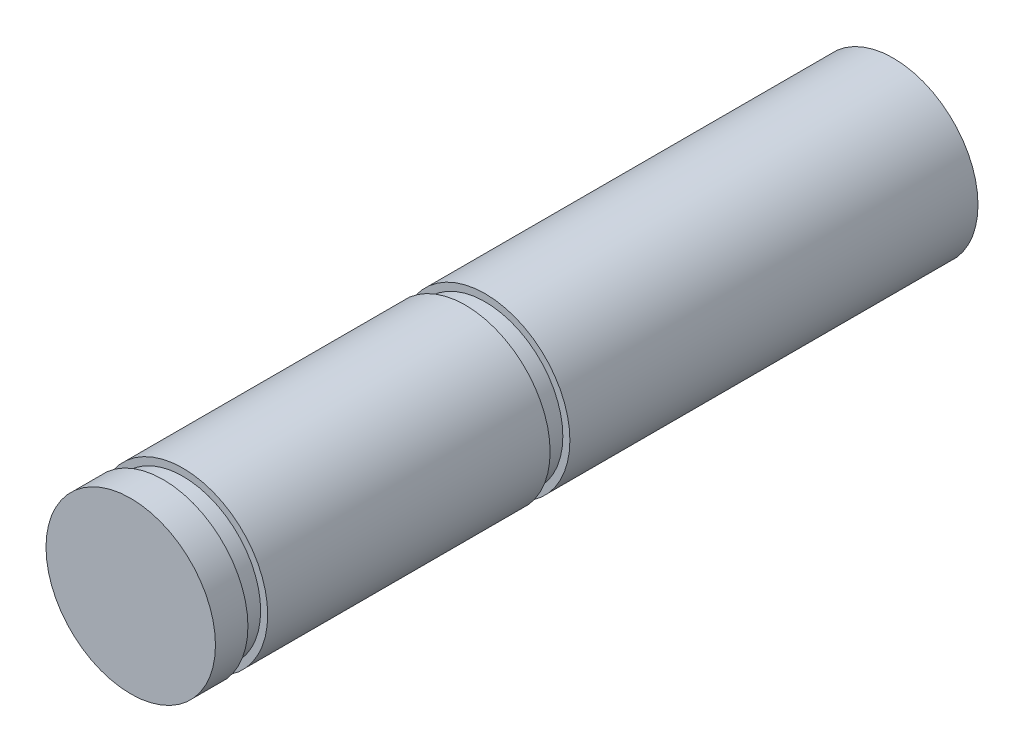
ISO-10303-21;
HEADER;
FILE_DESCRIPTION(('STEP AP214'),'2;1');
FILE_NAME('part.step','',(''),(''),'','','');
FILE_SCHEMA(('AUTOMOTIVE_DESIGN { 1 0 10303 214 1 1 1 1 }'));
ENDSEC;
DATA;
#1=APPLICATION_CONTEXT('core data for automotive mechanical design processes');
#2=APPLICATION_PROTOCOL_DEFINITION('international standard','automotive_design',2000,#1);
#3=PRODUCT_CONTEXT('',#1,'mechanical');
#4=PRODUCT('Part','Part','',(#3));
#5=PRODUCT_RELATED_PRODUCT_CATEGORY('part','',(#4));
#6=PRODUCT_DEFINITION_FORMATION('','',#4);
#7=PRODUCT_DEFINITION_CONTEXT('part definition',#1,'design');
#8=PRODUCT_DEFINITION('design','',#6,#7);
#9=PRODUCT_DEFINITION_SHAPE('','',#8);
#10=(LENGTH_UNIT() NAMED_UNIT(*) SI_UNIT(.MILLI.,.METRE.));
#11=(NAMED_UNIT(*) PLANE_ANGLE_UNIT() SI_UNIT($,.RADIAN.));
#12=(NAMED_UNIT(*) SI_UNIT($,.STERADIAN.) SOLID_ANGLE_UNIT());
#13=UNCERTAINTY_MEASURE_WITH_UNIT(LENGTH_MEASURE(1.E-05),#10,'distance_accuracy_value','');
#14=(GEOMETRIC_REPRESENTATION_CONTEXT(3) GLOBAL_UNCERTAINTY_ASSIGNED_CONTEXT((#13)) GLOBAL_UNIT_ASSIGNED_CONTEXT((#10,
#11,#12)) REPRESENTATION_CONTEXT('',''));
#15=CARTESIAN_POINT('',(0.,0.,0.));
#16=DIRECTION('',(0.,0.,1.));
#17=DIRECTION('',(1.,0.,0.));
#18=AXIS2_PLACEMENT_3D('',#15,#16,#17);
#19=CARTESIAN_POINT('',(0.,0.,27.));
#20=DIRECTION('',(0.,0.,-1.));
#21=DIRECTION('',(-1.,0.,0.));
#22=AXIS2_PLACEMENT_3D('',#19,#20,#21);
#23=CYLINDRICAL_SURFACE('',#22,3.);
#24=CARTESIAN_POINT('',(0.,0.,25.85));
#25=DIRECTION('',(0.,0.,1.));
#26=DIRECTION('',(1.,0.,0.));
#27=AXIS2_PLACEMENT_3D('',#24,#25,#26);
#28=CIRCLE('',#27,3.);
#29=CARTESIAN_POINT('',(3.,0.,25.85));
#30=VERTEX_POINT('',#29);
#31=EDGE_CURVE('E46',#30,#30,#28,.T.);
#32=ORIENTED_EDGE('',*,*,#31,.T.);
#33=EDGE_LOOP('',(#32));
#34=FACE_BOUND('',#33,.T.);
#35=CARTESIAN_POINT('',(0.,0.,27.));
#36=DIRECTION('',(0.,0.,1.));
#37=DIRECTION('',(1.,0.,0.));
#38=AXIS2_PLACEMENT_3D('',#35,#36,#37);
#39=CIRCLE('',#38,3.);
#40=CARTESIAN_POINT('',(3.,0.,27.));
#41=VERTEX_POINT('',#40);
#42=EDGE_CURVE('E10',#41,#41,#39,.T.);
#43=ORIENTED_EDGE('',*,*,#42,.F.);
#44=EDGE_LOOP('',(#43));
#45=FACE_BOUND('',#44,.T.);
#46=ADVANCED_FACE('F36',(#34,#45),#23,.T.);
#47=CARTESIAN_POINT('',(0.,0.,27.));
#48=DIRECTION('',(0.,0.,1.));
#49=DIRECTION('',(1.,0.,0.));
#50=AXIS2_PLACEMENT_3D('',#47,#48,#49);
#51=PLANE('',#50);
#52=ORIENTED_EDGE('',*,*,#42,.T.);
#53=EDGE_LOOP('',(#52));
#54=FACE_BOUND('',#53,.T.);
#55=ADVANCED_FACE('F95',(#54),#51,.T.);
#56=CARTESIAN_POINT('',(0.,0.,25.85));
#57=DIRECTION('',(0.,0.,1.));
#58=DIRECTION('',(1.,0.,0.));
#59=AXIS2_PLACEMENT_3D('',#56,#57,#58);
#60=PLANE('',#59);
#61=ORIENTED_EDGE('',*,*,#31,.F.);
#62=EDGE_LOOP('',(#61));
#63=FACE_BOUND('',#62,.T.);
#64=CARTESIAN_POINT('',(0.,0.,25.85));
#65=DIRECTION('',(0.,0.,1.));
#66=DIRECTION('',(1.,0.,0.));
#67=AXIS2_PLACEMENT_3D('',#64,#65,#66);
#68=CIRCLE('',#67,2.75);
#69=CARTESIAN_POINT('',(2.75,0.,25.85));
#70=VERTEX_POINT('',#69);
#71=EDGE_CURVE('E50',#70,#70,#68,.T.);
#72=ORIENTED_EDGE('',*,*,#71,.T.);
#73=EDGE_LOOP('',(#72));
#74=FACE_BOUND('',#73,.T.);
#75=ADVANCED_FACE('F100',(#63,#74),#60,.F.);
#76=CARTESIAN_POINT('',(0.,0.,25.85));
#77=DIRECTION('',(0.,0.,-1.));
#78=DIRECTION('',(-1.,0.,0.));
#79=AXIS2_PLACEMENT_3D('',#76,#77,#78);
#80=CYLINDRICAL_SURFACE('',#79,2.75);
#81=ORIENTED_EDGE('',*,*,#71,.F.);
#82=EDGE_LOOP('',(#81));
#83=FACE_BOUND('',#82,.T.);
#84=CARTESIAN_POINT('',(0.,0.,25.15));
#85=DIRECTION('',(0.,0.,1.));
#86=DIRECTION('',(1.,0.,0.));
#87=AXIS2_PLACEMENT_3D('',#84,#85,#86);
#88=CIRCLE('',#87,2.75);
#89=CARTESIAN_POINT('',(2.75,0.,25.15));
#90=VERTEX_POINT('',#89);
#91=EDGE_CURVE('E56',#90,#90,#88,.T.);
#92=ORIENTED_EDGE('',*,*,#91,.T.);
#93=EDGE_LOOP('',(#92));
#94=FACE_BOUND('',#93,.T.);
#95=ADVANCED_FACE('F107',(#83,#94),#80,.T.);
#96=CARTESIAN_POINT('',(0.,0.,25.15));
#97=DIRECTION('',(0.,0.,1.));
#98=DIRECTION('',(1.,0.,0.));
#99=AXIS2_PLACEMENT_3D('',#96,#97,#98);
#100=PLANE('',#99);
#101=ORIENTED_EDGE('',*,*,#91,.F.);
#102=EDGE_LOOP('',(#101));
#103=FACE_BOUND('',#102,.T.);
#104=CARTESIAN_POINT('',(0.,0.,25.15));
#105=DIRECTION('',(0.,0.,1.));
#106=DIRECTION('',(1.,0.,0.));
#107=AXIS2_PLACEMENT_3D('',#104,#105,#106);
#108=CIRCLE('',#107,3.);
#109=CARTESIAN_POINT('',(3.,0.,25.15));
#110=VERTEX_POINT('',#109);
#111=EDGE_CURVE('E53',#110,#110,#108,.T.);
#112=ORIENTED_EDGE('',*,*,#111,.T.);
#113=EDGE_LOOP('',(#112));
#114=FACE_BOUND('',#113,.T.);
#115=ADVANCED_FACE('F92',(#103,#114),#100,.T.);
#116=CARTESIAN_POINT('',(0.,0.,15.15));
#117=DIRECTION('',(0.,0.,1.));
#118=DIRECTION('',(1.,0.,0.));
#119=AXIS2_PLACEMENT_3D('',#116,#117,#118);
#120=CIRCLE('',#119,3.);
#121=CARTESIAN_POINT('',(3.,0.,15.15));
#122=VERTEX_POINT('',#121);
#123=EDGE_CURVE('E60',#122,#122,#120,.T.);
#124=ORIENTED_EDGE('',*,*,#123,.T.);
#125=EDGE_LOOP('',(#124));
#126=FACE_BOUND('',#125,.T.);
#127=ORIENTED_EDGE('',*,*,#111,.F.);
#128=EDGE_LOOP('',(#127));
#129=FACE_BOUND('',#128,.T.);
#130=ADVANCED_FACE('F79',(#126,#129),#23,.T.);
#131=CARTESIAN_POINT('',(0.,0.,14.45));
#132=DIRECTION('',(0.,0.,1.));
#133=DIRECTION('',(1.,0.,0.));
#134=AXIS2_PLACEMENT_3D('',#131,#132,#133);
#135=PLANE('',#134);
#136=CARTESIAN_POINT('',(0.,0.,14.45));
#137=DIRECTION('',(0.,0.,1.));
#138=DIRECTION('',(1.,0.,0.));
#139=AXIS2_PLACEMENT_3D('',#136,#137,#138);
#140=CIRCLE('',#139,2.75);
#141=CARTESIAN_POINT('',(2.75,0.,14.45));
#142=VERTEX_POINT('',#141);
#143=EDGE_CURVE('E63',#142,#142,#140,.T.);
#144=ORIENTED_EDGE('',*,*,#143,.F.);
#145=EDGE_LOOP('',(#144));
#146=FACE_BOUND('',#145,.T.);
#147=CARTESIAN_POINT('',(0.,0.,14.45));
#148=DIRECTION('',(0.,0.,1.));
#149=DIRECTION('',(1.,0.,0.));
#150=AXIS2_PLACEMENT_3D('',#147,#148,#149);
#151=CIRCLE('',#150,3.);
#152=CARTESIAN_POINT('',(3.,0.,14.45));
#153=VERTEX_POINT('',#152);
#154=EDGE_CURVE('E59',#153,#153,#151,.T.);
#155=ORIENTED_EDGE('',*,*,#154,.T.);
#156=EDGE_LOOP('',(#155));
#157=FACE_BOUND('',#156,.T.);
#158=ADVANCED_FACE('F75',(#146,#157),#135,.T.);
#159=CARTESIAN_POINT('',(0.,0.,15.15));
#160=DIRECTION('',(0.,0.,1.));
#161=DIRECTION('',(1.,0.,0.));
#162=AXIS2_PLACEMENT_3D('',#159,#160,#161);
#163=PLANE('',#162);
#164=CARTESIAN_POINT('',(0.,0.,15.15));
#165=DIRECTION('',(0.,0.,1.));
#166=DIRECTION('',(1.,0.,0.));
#167=AXIS2_PLACEMENT_3D('',#164,#165,#166);
#168=CIRCLE('',#167,2.75);
#169=CARTESIAN_POINT('',(2.75,0.,15.15));
#170=VERTEX_POINT('',#169);
#171=EDGE_CURVE('E66',#170,#170,#168,.T.);
#172=ORIENTED_EDGE('',*,*,#171,.T.);
#173=EDGE_LOOP('',(#172));
#174=FACE_BOUND('',#173,.T.);
#175=ORIENTED_EDGE('',*,*,#123,.F.);
#176=EDGE_LOOP('',(#175));
#177=FACE_BOUND('',#176,.T.);
#178=ADVANCED_FACE('F78',(#174,#177),#163,.F.);
#179=CARTESIAN_POINT('',(0.,0.,14.45));
#180=DIRECTION('',(0.,0.,1.));
#181=DIRECTION('',(1.,0.,0.));
#182=AXIS2_PLACEMENT_3D('',#179,#180,#181);
#183=CYLINDRICAL_SURFACE('',#182,2.75);
#184=ORIENTED_EDGE('',*,*,#143,.T.);
#185=EDGE_LOOP('',(#184));
#186=FACE_BOUND('',#185,.T.);
#187=ORIENTED_EDGE('',*,*,#171,.F.);
#188=EDGE_LOOP('',(#187));
#189=FACE_BOUND('',#188,.T.);
#190=ADVANCED_FACE('F72',(#186,#189),#183,.T.);
#191=CARTESIAN_POINT('',(0.,0.,0.));
#192=DIRECTION('',(0.,0.,1.));
#193=DIRECTION('',(1.,0.,0.));
#194=AXIS2_PLACEMENT_3D('',#191,#192,#193);
#195=PLANE('',#194);
#196=CARTESIAN_POINT('',(0.,0.,0.));
#197=DIRECTION('',(0.,0.,1.));
#198=DIRECTION('',(1.,0.,0.));
#199=AXIS2_PLACEMENT_3D('',#196,#197,#198);
#200=CIRCLE('',#199,3.);
#201=CARTESIAN_POINT('',(3.,0.,0.));
#202=VERTEX_POINT('',#201);
#203=EDGE_CURVE('E39',#202,#202,#200,.T.);
#204=ORIENTED_EDGE('',*,*,#203,.F.);
#205=EDGE_LOOP('',(#204));
#206=FACE_BOUND('',#205,.T.);
#207=ADVANCED_FACE('F85',(#206),#195,.F.);
#208=ORIENTED_EDGE('',*,*,#203,.T.);
#209=EDGE_LOOP('',(#208));
#210=FACE_BOUND('',#209,.T.);
#211=ORIENTED_EDGE('',*,*,#154,.F.);
#212=EDGE_LOOP('',(#211));
#213=FACE_BOUND('',#212,.T.);
#214=ADVANCED_FACE('F83',(#210,#213),#23,.T.);
#215=CLOSED_SHELL('',(#46,#55,#75,#95,#115,#130,#158,#178,#190,#207,#214));
#216=MANIFOLD_SOLID_BREP('B2',#215);
#217=ADVANCED_BREP_SHAPE_REPRESENTATION('',(#18,#216),#14);
#218=SHAPE_DEFINITION_REPRESENTATION(#9,#217);
ENDSEC;
END-ISO-10303-21;
